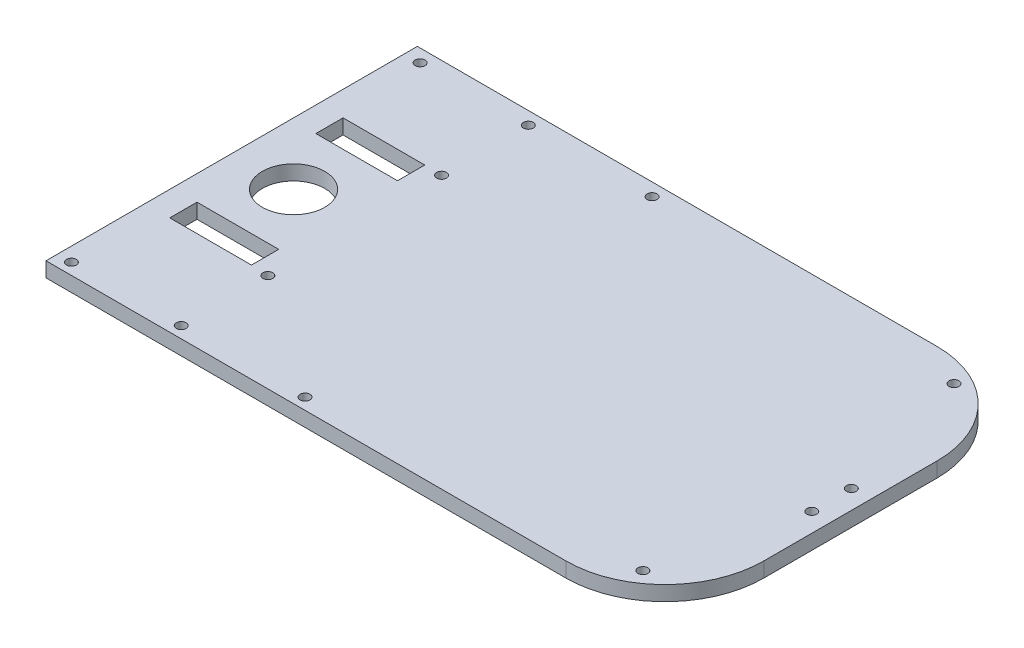
ISO-10303-21;
HEADER;
FILE_DESCRIPTION(('STEP AP214'),'2;1');
FILE_NAME('part.step','',(''),(''),'','','');
FILE_SCHEMA(('AUTOMOTIVE_DESIGN { 1 0 10303 214 1 1 1 1 }'));
ENDSEC;
DATA;
#1=APPLICATION_CONTEXT('core data for automotive mechanical design processes');
#2=APPLICATION_PROTOCOL_DEFINITION('international standard','automotive_design',2000,#1);
#3=PRODUCT_CONTEXT('',#1,'mechanical');
#4=PRODUCT('Part','Part','',(#3));
#5=PRODUCT_RELATED_PRODUCT_CATEGORY('part','',(#4));
#6=PRODUCT_DEFINITION_FORMATION('','',#4);
#7=PRODUCT_DEFINITION_CONTEXT('part definition',#1,'design');
#8=PRODUCT_DEFINITION('design','',#6,#7);
#9=PRODUCT_DEFINITION_SHAPE('','',#8);
#10=(LENGTH_UNIT() NAMED_UNIT(*) SI_UNIT(.MILLI.,.METRE.));
#11=(NAMED_UNIT(*) PLANE_ANGLE_UNIT() SI_UNIT($,.RADIAN.));
#12=(NAMED_UNIT(*) SI_UNIT($,.STERADIAN.) SOLID_ANGLE_UNIT());
#13=UNCERTAINTY_MEASURE_WITH_UNIT(LENGTH_MEASURE(1.E-05),#10,'distance_accuracy_value','');
#14=(GEOMETRIC_REPRESENTATION_CONTEXT(3) GLOBAL_UNCERTAINTY_ASSIGNED_CONTEXT((#13)) GLOBAL_UNIT_ASSIGNED_CONTEXT((#10,
#11,#12)) REPRESENTATION_CONTEXT('',''));
#15=CARTESIAN_POINT('',(0.,0.,0.));
#16=DIRECTION('',(0.,0.,1.));
#17=DIRECTION('',(1.,0.,0.));
#18=AXIS2_PLACEMENT_3D('',#15,#16,#17);
#19=CARTESIAN_POINT('',(0.,6.,0.));
#20=DIRECTION('',(1.,0.,0.));
#21=DIRECTION('',(0.,0.,-1.));
#22=AXIS2_PLACEMENT_3D('',#19,#20,#21);
#23=PLANE('',#22);
#24=DIRECTION('',(0.,0.,1.));
#25=VECTOR('',#24,1.);
#26=CARTESIAN_POINT('',(0.,0.,0.));
#27=LINE('',#26,#25);
#28=CARTESIAN_POINT('',(0.,0.,-150.));
#29=VERTEX_POINT('',#28);
#30=CARTESIAN_POINT('',(0.,0.,0.));
#31=VERTEX_POINT('',#30);
#32=EDGE_CURVE('E339',#29,#31,#27,.T.);
#33=ORIENTED_EDGE('',*,*,#32,.T.);
#34=DIRECTION('',(0.,-1.,0.));
#35=VECTOR('',#34,1.);
#36=CARTESIAN_POINT('',(0.,6.,0.));
#37=LINE('',#36,#35);
#38=CARTESIAN_POINT('',(0.,6.,0.));
#39=VERTEX_POINT('',#38);
#40=EDGE_CURVE('E11',#39,#31,#37,.T.);
#41=ORIENTED_EDGE('',*,*,#40,.F.);
#42=DIRECTION('',(0.,0.,1.));
#43=VECTOR('',#42,1.);
#44=CARTESIAN_POINT('',(0.,6.,0.));
#45=LINE('',#44,#43);
#46=CARTESIAN_POINT('',(0.,6.,-150.));
#47=VERTEX_POINT('',#46);
#48=EDGE_CURVE('E343',#47,#39,#45,.T.);
#49=ORIENTED_EDGE('',*,*,#48,.F.);
#50=DIRECTION('',(0.,-1.,0.));
#51=VECTOR('',#50,1.);
#52=CARTESIAN_POINT('',(0.,6.,-150.));
#53=LINE('',#52,#51);
#54=EDGE_CURVE('E363',#47,#29,#53,.T.);
#55=ORIENTED_EDGE('',*,*,#54,.T.);
#56=EDGE_LOOP('',(#33,#41,#49,#55));
#57=FACE_BOUND('',#56,.T.);
#58=ADVANCED_FACE('F44',(#57),#23,.F.);
#59=CARTESIAN_POINT('',(0.,6.,0.));
#60=DIRECTION('',(0.,0.,-1.));
#61=DIRECTION('',(-1.,0.,0.));
#62=AXIS2_PLACEMENT_3D('',#59,#60,#61);
#63=PLANE('',#62);
#64=DIRECTION('',(1.,0.,0.));
#65=VECTOR('',#64,1.);
#66=CARTESIAN_POINT('',(0.,0.,0.));
#67=LINE('',#66,#65);
#68=CARTESIAN_POINT('',(210.,0.,0.));
#69=VERTEX_POINT('',#68);
#70=EDGE_CURVE('E367',#31,#69,#67,.T.);
#71=ORIENTED_EDGE('',*,*,#70,.T.);
#72=DIRECTION('',(0.,-1.,0.));
#73=VECTOR('',#72,1.);
#74=CARTESIAN_POINT('',(210.,6.,0.));
#75=LINE('',#74,#73);
#76=CARTESIAN_POINT('',(210.,6.,0.));
#77=VERTEX_POINT('',#76);
#78=EDGE_CURVE('E52',#77,#69,#75,.T.);
#79=ORIENTED_EDGE('',*,*,#78,.F.);
#80=DIRECTION('',(1.,0.,0.));
#81=VECTOR('',#80,1.);
#82=CARTESIAN_POINT('',(0.,6.,0.));
#83=LINE('',#82,#81);
#84=EDGE_CURVE('E347',#39,#77,#83,.T.);
#85=ORIENTED_EDGE('',*,*,#84,.F.);
#86=ORIENTED_EDGE('',*,*,#40,.T.);
#87=EDGE_LOOP('',(#71,#79,#85,#86));
#88=FACE_BOUND('',#87,.T.);
#89=ADVANCED_FACE('F423',(#88),#63,.F.);
#90=CARTESIAN_POINT('',(210.,6.,-40.));
#91=DIRECTION('',(0.,-1.,0.));
#92=DIRECTION('',(0.,0.,-1.));
#93=AXIS2_PLACEMENT_3D('',#90,#91,#92);
#94=CYLINDRICAL_SURFACE('',#93,40.);
#95=CARTESIAN_POINT('',(210.,0.,-40.));
#96=DIRECTION('',(0.,1.,0.));
#97=DIRECTION('',(0.,0.,1.));
#98=AXIS2_PLACEMENT_3D('',#95,#96,#97);
#99=CIRCLE('',#98,40.);
#100=CARTESIAN_POINT('',(250.,0.,-40.0000000000003));
#101=VERTEX_POINT('',#100);
#102=EDGE_CURVE('E370',#69,#101,#99,.T.);
#103=ORIENTED_EDGE('',*,*,#102,.T.);
#104=DIRECTION('',(0.,-1.,0.));
#105=VECTOR('',#104,1.);
#106=CARTESIAN_POINT('',(250.,6.,-40.0000000000003));
#107=LINE('',#106,#105);
#108=CARTESIAN_POINT('',(250.,6.,-40.0000000000003));
#109=VERTEX_POINT('',#108);
#110=EDGE_CURVE('E392',#109,#101,#107,.T.);
#111=ORIENTED_EDGE('',*,*,#110,.F.);
#112=CARTESIAN_POINT('',(210.,6.,-40.));
#113=DIRECTION('',(0.,1.,0.));
#114=DIRECTION('',(0.,0.,1.));
#115=AXIS2_PLACEMENT_3D('',#112,#113,#114);
#116=CIRCLE('',#115,40.);
#117=EDGE_CURVE('E351',#77,#109,#116,.T.);
#118=ORIENTED_EDGE('',*,*,#117,.F.);
#119=ORIENTED_EDGE('',*,*,#78,.T.);
#120=EDGE_LOOP('',(#103,#111,#118,#119));
#121=FACE_BOUND('',#120,.T.);
#122=ADVANCED_FACE('F401',(#121),#94,.T.);
#123=CARTESIAN_POINT('',(250.,6.,-40.0000000000003));
#124=DIRECTION('',(-1.,0.,0.));
#125=DIRECTION('',(0.,0.,1.));
#126=AXIS2_PLACEMENT_3D('',#123,#124,#125);
#127=PLANE('',#126);
#128=DIRECTION('',(0.,0.,-1.));
#129=VECTOR('',#128,1.);
#130=CARTESIAN_POINT('',(250.,0.,-40.0000000000003));
#131=LINE('',#130,#129);
#132=CARTESIAN_POINT('',(250.,0.,-110.));
#133=VERTEX_POINT('',#132);
#134=EDGE_CURVE('E373',#101,#133,#131,.T.);
#135=ORIENTED_EDGE('',*,*,#134,.T.);
#136=DIRECTION('',(0.,-1.,0.));
#137=VECTOR('',#136,1.);
#138=CARTESIAN_POINT('',(250.,6.,-110.));
#139=LINE('',#138,#137);
#140=CARTESIAN_POINT('',(250.,6.,-110.));
#141=VERTEX_POINT('',#140);
#142=EDGE_CURVE('E388',#141,#133,#139,.T.);
#143=ORIENTED_EDGE('',*,*,#142,.F.);
#144=DIRECTION('',(0.,0.,-1.));
#145=VECTOR('',#144,1.);
#146=CARTESIAN_POINT('',(250.,6.,-40.0000000000003));
#147=LINE('',#146,#145);
#148=EDGE_CURVE('E354',#109,#141,#147,.T.);
#149=ORIENTED_EDGE('',*,*,#148,.F.);
#150=ORIENTED_EDGE('',*,*,#110,.T.);
#151=EDGE_LOOP('',(#135,#143,#149,#150));
#152=FACE_BOUND('',#151,.T.);
#153=ADVANCED_FACE('F411',(#152),#127,.F.);
#154=CARTESIAN_POINT('',(210.,6.,-110.));
#155=DIRECTION('',(0.,-1.,0.));
#156=DIRECTION('',(0.,0.,-1.));
#157=AXIS2_PLACEMENT_3D('',#154,#155,#156);
#158=CYLINDRICAL_SURFACE('',#157,40.);
#159=CARTESIAN_POINT('',(210.,0.,-110.));
#160=DIRECTION('',(0.,1.,0.));
#161=DIRECTION('',(0.,0.,1.));
#162=AXIS2_PLACEMENT_3D('',#159,#160,#161);
#163=CIRCLE('',#162,40.);
#164=CARTESIAN_POINT('',(210.,0.,-150.));
#165=VERTEX_POINT('',#164);
#166=EDGE_CURVE('E376',#133,#165,#163,.T.);
#167=ORIENTED_EDGE('',*,*,#166,.T.);
#168=DIRECTION('',(0.,-1.,0.));
#169=VECTOR('',#168,1.);
#170=CARTESIAN_POINT('',(210.,6.,-150.));
#171=LINE('',#170,#169);
#172=CARTESIAN_POINT('',(210.,6.,-150.));
#173=VERTEX_POINT('',#172);
#174=EDGE_CURVE('E384',#173,#165,#171,.T.);
#175=ORIENTED_EDGE('',*,*,#174,.F.);
#176=CARTESIAN_POINT('',(210.,6.,-110.));
#177=DIRECTION('',(0.,1.,0.));
#178=DIRECTION('',(0.,0.,1.));
#179=AXIS2_PLACEMENT_3D('',#176,#177,#178);
#180=CIRCLE('',#179,40.);
#181=EDGE_CURVE('E357',#141,#173,#180,.T.);
#182=ORIENTED_EDGE('',*,*,#181,.F.);
#183=ORIENTED_EDGE('',*,*,#142,.T.);
#184=EDGE_LOOP('',(#167,#175,#182,#183));
#185=FACE_BOUND('',#184,.T.);
#186=ADVANCED_FACE('F415',(#185),#158,.T.);
#187=CARTESIAN_POINT('',(0.,6.,-150.));
#188=DIRECTION('',(0.,0.,1.));
#189=DIRECTION('',(1.,0.,0.));
#190=AXIS2_PLACEMENT_3D('',#187,#188,#189);
#191=PLANE('',#190);
#192=DIRECTION('',(-1.,0.,0.));
#193=VECTOR('',#192,1.);
#194=CARTESIAN_POINT('',(0.,0.,-150.));
#195=LINE('',#194,#193);
#196=EDGE_CURVE('E348',#165,#29,#195,.T.);
#197=ORIENTED_EDGE('',*,*,#196,.T.);
#198=ORIENTED_EDGE('',*,*,#54,.F.);
#199=DIRECTION('',(-1.,0.,0.));
#200=VECTOR('',#199,1.);
#201=CARTESIAN_POINT('',(0.,6.,-150.));
#202=LINE('',#201,#200);
#203=EDGE_CURVE('E360',#173,#47,#202,.T.);
#204=ORIENTED_EDGE('',*,*,#203,.F.);
#205=ORIENTED_EDGE('',*,*,#174,.T.);
#206=EDGE_LOOP('',(#197,#198,#204,#205));
#207=FACE_BOUND('',#206,.T.);
#208=ADVANCED_FACE('F426',(#207),#191,.F.);
#209=CARTESIAN_POINT('',(210.,6.,-110.));
#210=DIRECTION('',(0.,1.,0.));
#211=DIRECTION('',(0.,0.,1.));
#212=AXIS2_PLACEMENT_3D('',#209,#210,#211);
#213=PLANE('',#212);
#214=DIRECTION('',(0.,0.,1.));
#215=VECTOR('',#214,1.);
#216=CARTESIAN_POINT('',(10.,6.,-110.));
#217=LINE('',#216,#215);
#218=CARTESIAN_POINT('',(10.,6.,-110.));
#219=VERTEX_POINT('',#218);
#220=CARTESIAN_POINT('',(10.,6.,-99.));
#221=VERTEX_POINT('',#220);
#222=EDGE_CURVE('E59',#219,#221,#217,.T.);
#223=ORIENTED_EDGE('',*,*,#222,.F.);
#224=DIRECTION('',(-1.,0.,0.));
#225=VECTOR('',#224,1.);
#226=CARTESIAN_POINT('',(10.,6.,-110.));
#227=LINE('',#226,#225);
#228=CARTESIAN_POINT('',(43.,6.,-110.));
#229=VERTEX_POINT('',#228);
#230=EDGE_CURVE('E169',#229,#219,#227,.T.);
#231=ORIENTED_EDGE('',*,*,#230,.F.);
#232=DIRECTION('',(0.,0.,-1.));
#233=VECTOR('',#232,1.);
#234=CARTESIAN_POINT('',(43.,6.,-110.));
#235=LINE('',#234,#233);
#236=CARTESIAN_POINT('',(43.,6.,-99.));
#237=VERTEX_POINT('',#236);
#238=EDGE_CURVE('E173',#237,#229,#235,.T.);
#239=ORIENTED_EDGE('',*,*,#238,.F.);
#240=DIRECTION('',(1.,0.,0.));
#241=VECTOR('',#240,1.);
#242=CARTESIAN_POINT('',(10.,6.,-99.));
#243=LINE('',#242,#241);
#244=EDGE_CURVE('E182',#221,#237,#243,.T.);
#245=ORIENTED_EDGE('',*,*,#244,.F.);
#246=EDGE_LOOP('',(#223,#231,#239,#245));
#247=FACE_BOUND('',#246,.T.);
#248=DIRECTION('',(0.,0.,1.));
#249=VECTOR('',#248,1.);
#250=CARTESIAN_POINT('',(10.,6.,-51.));
#251=LINE('',#250,#249);
#252=CARTESIAN_POINT('',(10.,6.,-51.));
#253=VERTEX_POINT('',#252);
#254=CARTESIAN_POINT('',(10.,6.,-40.));
#255=VERTEX_POINT('',#254);
#256=EDGE_CURVE('E67',#253,#255,#251,.T.);
#257=ORIENTED_EDGE('',*,*,#256,.F.);
#258=DIRECTION('',(-1.,0.,0.));
#259=VECTOR('',#258,1.);
#260=CARTESIAN_POINT('',(10.,6.,-51.));
#261=LINE('',#260,#259);
#262=CARTESIAN_POINT('',(43.,6.,-51.));
#263=VERTEX_POINT('',#262);
#264=EDGE_CURVE('E210',#263,#253,#261,.T.);
#265=ORIENTED_EDGE('',*,*,#264,.F.);
#266=DIRECTION('',(0.,0.,-1.));
#267=VECTOR('',#266,1.);
#268=CARTESIAN_POINT('',(43.,6.,-51.));
#269=LINE('',#268,#267);
#270=CARTESIAN_POINT('',(43.,6.,-40.));
#271=VERTEX_POINT('',#270);
#272=EDGE_CURVE('E214',#271,#263,#269,.T.);
#273=ORIENTED_EDGE('',*,*,#272,.F.);
#274=DIRECTION('',(1.,0.,0.));
#275=VECTOR('',#274,1.);
#276=CARTESIAN_POINT('',(10.,6.,-40.));
#277=LINE('',#276,#275);
#278=EDGE_CURVE('E219',#255,#271,#277,.T.);
#279=ORIENTED_EDGE('',*,*,#278,.F.);
#280=EDGE_LOOP('',(#257,#265,#273,#279));
#281=FACE_BOUND('',#280,.T.);
#282=CARTESIAN_POINT('',(50.,6.,-4.63));
#283=DIRECTION('',(0.,1.,0.));
#284=DIRECTION('',(0.,0.,1.));
#285=AXIS2_PLACEMENT_3D('',#282,#283,#284);
#286=CIRCLE('',#285,2.);
#287=CARTESIAN_POINT('',(50.,6.,-2.63));
#288=VERTEX_POINT('',#287);
#289=EDGE_CURVE('E247',#288,#288,#286,.T.);
#290=ORIENTED_EDGE('',*,*,#289,.F.);
#291=EDGE_LOOP('',(#290));
#292=FACE_BOUND('',#291,.T.);
#293=CARTESIAN_POINT('',(100.,6.,-4.63));
#294=DIRECTION('',(0.,1.,0.));
#295=DIRECTION('',(0.,0.,1.));
#296=AXIS2_PLACEMENT_3D('',#293,#294,#295);
#297=CIRCLE('',#296,2.);
#298=CARTESIAN_POINT('',(100.,6.,-2.63));
#299=VERTEX_POINT('',#298);
#300=EDGE_CURVE('E256',#299,#299,#297,.T.);
#301=ORIENTED_EDGE('',*,*,#300,.F.);
#302=EDGE_LOOP('',(#301));
#303=FACE_BOUND('',#302,.T.);
#304=CARTESIAN_POINT('',(100.,6.,-144.82));
#305=DIRECTION('',(0.,1.,0.));
#306=DIRECTION('',(0.,0.,1.));
#307=AXIS2_PLACEMENT_3D('',#304,#305,#306);
#308=CIRCLE('',#307,2.);
#309=CARTESIAN_POINT('',(100.,6.,-142.82));
#310=VERTEX_POINT('',#309);
#311=EDGE_CURVE('E264',#310,#310,#308,.T.);
#312=ORIENTED_EDGE('',*,*,#311,.F.);
#313=EDGE_LOOP('',(#312));
#314=FACE_BOUND('',#313,.T.);
#315=CARTESIAN_POINT('',(50.,6.,-109.82));
#316=DIRECTION('',(0.,1.,0.));
#317=DIRECTION('',(0.,0.,1.));
#318=AXIS2_PLACEMENT_3D('',#315,#316,#317);
#319=CIRCLE('',#318,2.);
#320=CARTESIAN_POINT('',(50.,6.,-107.82));
#321=VERTEX_POINT('',#320);
#322=EDGE_CURVE('E272',#321,#321,#319,.T.);
#323=ORIENTED_EDGE('',*,*,#322,.F.);
#324=EDGE_LOOP('',(#323));
#325=FACE_BOUND('',#324,.T.);
#326=CARTESIAN_POINT('',(50.,6.,-39.63));
#327=DIRECTION('',(0.,1.,0.));
#328=DIRECTION('',(0.,0.,1.));
#329=AXIS2_PLACEMENT_3D('',#326,#327,#328);
#330=CIRCLE('',#329,2.);
#331=CARTESIAN_POINT('',(50.,6.,-37.63));
#332=VERTEX_POINT('',#331);
#333=EDGE_CURVE('E239',#332,#332,#330,.T.);
#334=ORIENTED_EDGE('',*,*,#333,.F.);
#335=EDGE_LOOP('',(#334));
#336=FACE_BOUND('',#335,.T.);
#337=CARTESIAN_POINT('',(50.,6.,-144.82));
#338=DIRECTION('',(0.,1.,0.));
#339=DIRECTION('',(0.,0.,1.));
#340=AXIS2_PLACEMENT_3D('',#337,#338,#339);
#341=CIRCLE('',#340,2.);
#342=CARTESIAN_POINT('',(50.,6.,-142.82));
#343=VERTEX_POINT('',#342);
#344=EDGE_CURVE('E251',#343,#343,#341,.T.);
#345=ORIENTED_EDGE('',*,*,#344,.F.);
#346=EDGE_LOOP('',(#345));
#347=FACE_BOUND('',#346,.T.);
#348=CARTESIAN_POINT('',(242.339859995876,6.,-83.));
#349=DIRECTION('',(0.,1.,0.));
#350=DIRECTION('',(0.,0.,1.));
#351=AXIS2_PLACEMENT_3D('',#348,#349,#350);
#352=CIRCLE('',#351,2.);
#353=CARTESIAN_POINT('',(242.339859995876,6.,-81.));
#354=VERTEX_POINT('',#353);
#355=EDGE_CURVE('E292',#354,#354,#352,.T.);
#356=ORIENTED_EDGE('',*,*,#355,.F.);
#357=EDGE_LOOP('',(#356));
#358=FACE_BOUND('',#357,.T.);
#359=CARTESIAN_POINT('',(242.339859995876,6.,-67.));
#360=DIRECTION('',(0.,1.,0.));
#361=DIRECTION('',(0.,0.,1.));
#362=AXIS2_PLACEMENT_3D('',#359,#360,#361);
#363=CIRCLE('',#362,2.);
#364=CARTESIAN_POINT('',(242.339859995876,6.,-65.));
#365=VERTEX_POINT('',#364);
#366=EDGE_CURVE('E296',#365,#365,#363,.T.);
#367=ORIENTED_EDGE('',*,*,#366,.F.);
#368=EDGE_LOOP('',(#367));
#369=FACE_BOUND('',#368,.T.);
#370=CARTESIAN_POINT('',(228.949949787565,6.,-12.1645825910987));
#371=DIRECTION('',(0.,1.,0.));
#372=DIRECTION('',(0.,0.,1.));
#373=AXIS2_PLACEMENT_3D('',#370,#371,#372);
#374=CIRCLE('',#373,2.);
#375=CARTESIAN_POINT('',(228.949949787565,6.,-10.1645825910987));
#376=VERTEX_POINT('',#375);
#377=EDGE_CURVE('E291',#376,#376,#374,.T.);
#378=ORIENTED_EDGE('',*,*,#377,.F.);
#379=EDGE_LOOP('',(#378));
#380=FACE_BOUND('',#379,.T.);
#381=CARTESIAN_POINT('',(226.364130141109,6.,-140.421237055358));
#382=DIRECTION('',(0.,1.,0.));
#383=DIRECTION('',(0.,0.,1.));
#384=AXIS2_PLACEMENT_3D('',#381,#382,#383);
#385=CIRCLE('',#384,2.);
#386=CARTESIAN_POINT('',(226.364130141109,6.,-138.421237055358));
#387=VERTEX_POINT('',#386);
#388=EDGE_CURVE('E307',#387,#387,#385,.T.);
#389=ORIENTED_EDGE('',*,*,#388,.F.);
#390=EDGE_LOOP('',(#389));
#391=FACE_BOUND('',#390,.T.);
#392=CARTESIAN_POINT('',(5.63572035741244,6.,-4.63282920356067));
#393=DIRECTION('',(0.,1.,0.));
#394=DIRECTION('',(0.,0.,1.));
#395=AXIS2_PLACEMENT_3D('',#392,#393,#394);
#396=CIRCLE('',#395,2.);
#397=CARTESIAN_POINT('',(5.63572035741244,6.,-2.63282920356067));
#398=VERTEX_POINT('',#397);
#399=EDGE_CURVE('E315',#398,#398,#396,.T.);
#400=ORIENTED_EDGE('',*,*,#399,.F.);
#401=EDGE_LOOP('',(#400));
#402=FACE_BOUND('',#401,.T.);
#403=CARTESIAN_POINT('',(6.31087822763052,6.,-144.817130454335));
#404=DIRECTION('',(0.,1.,0.));
#405=DIRECTION('',(0.,0.,1.));
#406=AXIS2_PLACEMENT_3D('',#403,#404,#405);
#407=CIRCLE('',#406,2.);
#408=CARTESIAN_POINT('',(6.31087822763052,6.,-142.817130454335));
#409=VERTEX_POINT('',#408);
#410=EDGE_CURVE('E323',#409,#409,#407,.T.);
#411=ORIENTED_EDGE('',*,*,#410,.F.);
#412=EDGE_LOOP('',(#411));
#413=FACE_BOUND('',#412,.T.);
#414=CARTESIAN_POINT('',(25.,6.,-75.));
#415=DIRECTION('',(0.,-1.,0.));
#416=DIRECTION('',(0.,0.,-1.));
#417=AXIS2_PLACEMENT_3D('',#414,#415,#416);
#418=CIRCLE('',#417,12.59794853);
#419=CARTESIAN_POINT('',(25.,6.,-87.59794853));
#420=VERTEX_POINT('',#419);
#421=EDGE_CURVE('E335',#420,#420,#418,.T.);
#422=ORIENTED_EDGE('',*,*,#421,.T.);
#423=EDGE_LOOP('',(#422));
#424=FACE_BOUND('',#423,.T.);
#425=ORIENTED_EDGE('',*,*,#48,.T.);
#426=ORIENTED_EDGE('',*,*,#84,.T.);
#427=ORIENTED_EDGE('',*,*,#117,.T.);
#428=ORIENTED_EDGE('',*,*,#148,.T.);
#429=ORIENTED_EDGE('',*,*,#181,.T.);
#430=ORIENTED_EDGE('',*,*,#203,.T.);
#431=EDGE_LOOP('',(#425,#426,#427,#428,#429,#430));
#432=FACE_BOUND('',#431,.T.);
#433=ADVANCED_FACE('F419',(#247,#281,#292,#303,#314,#325,#336,#347,#358,#369,#380,#391,#402,
#413,#424,#432),#213,.T.);
#434=CARTESIAN_POINT('',(210.,0.,-110.));
#435=DIRECTION('',(0.,1.,0.));
#436=DIRECTION('',(0.,0.,1.));
#437=AXIS2_PLACEMENT_3D('',#434,#435,#436);
#438=PLANE('',#437);
#439=DIRECTION('',(-1.,0.,0.));
#440=VECTOR('',#439,1.);
#441=CARTESIAN_POINT('',(10.,0.,-110.));
#442=LINE('',#441,#440);
#443=CARTESIAN_POINT('',(43.,0.,-110.));
#444=VERTEX_POINT('',#443);
#445=CARTESIAN_POINT('',(10.,0.,-110.));
#446=VERTEX_POINT('',#445);
#447=EDGE_CURVE('E154',#444,#446,#442,.T.);
#448=ORIENTED_EDGE('',*,*,#447,.T.);
#449=DIRECTION('',(0.,0.,1.));
#450=VECTOR('',#449,1.);
#451=CARTESIAN_POINT('',(10.,0.,-110.));
#452=LINE('',#451,#450);
#453=CARTESIAN_POINT('',(10.,0.,-99.));
#454=VERTEX_POINT('',#453);
#455=EDGE_CURVE('E147',#446,#454,#452,.T.);
#456=ORIENTED_EDGE('',*,*,#455,.T.);
#457=DIRECTION('',(1.,0.,0.));
#458=VECTOR('',#457,1.);
#459=CARTESIAN_POINT('',(10.,0.,-99.));
#460=LINE('',#459,#458);
#461=CARTESIAN_POINT('',(43.,0.,-99.));
#462=VERTEX_POINT('',#461);
#463=EDGE_CURVE('E158',#454,#462,#460,.T.);
#464=ORIENTED_EDGE('',*,*,#463,.T.);
#465=DIRECTION('',(0.,0.,-1.));
#466=VECTOR('',#465,1.);
#467=CARTESIAN_POINT('',(43.,0.,-110.));
#468=LINE('',#467,#466);
#469=EDGE_CURVE('E163',#462,#444,#468,.T.);
#470=ORIENTED_EDGE('',*,*,#469,.T.);
#471=EDGE_LOOP('',(#448,#456,#464,#470));
#472=FACE_BOUND('',#471,.T.);
#473=DIRECTION('',(-1.,0.,0.));
#474=VECTOR('',#473,1.);
#475=CARTESIAN_POINT('',(10.,0.,-51.));
#476=LINE('',#475,#474);
#477=CARTESIAN_POINT('',(43.,0.,-51.));
#478=VERTEX_POINT('',#477);
#479=CARTESIAN_POINT('',(10.,0.,-51.));
#480=VERTEX_POINT('',#479);
#481=EDGE_CURVE('E200',#478,#480,#476,.T.);
#482=ORIENTED_EDGE('',*,*,#481,.T.);
#483=DIRECTION('',(0.,0.,1.));
#484=VECTOR('',#483,1.);
#485=CARTESIAN_POINT('',(10.,0.,-51.));
#486=LINE('',#485,#484);
#487=CARTESIAN_POINT('',(10.,0.,-40.));
#488=VERTEX_POINT('',#487);
#489=EDGE_CURVE('E215',#480,#488,#486,.T.);
#490=ORIENTED_EDGE('',*,*,#489,.T.);
#491=DIRECTION('',(1.,0.,0.));
#492=VECTOR('',#491,1.);
#493=CARTESIAN_POINT('',(10.,0.,-40.));
#494=LINE('',#493,#492);
#495=CARTESIAN_POINT('',(43.,0.,-40.));
#496=VERTEX_POINT('',#495);
#497=EDGE_CURVE('E232',#488,#496,#494,.T.);
#498=ORIENTED_EDGE('',*,*,#497,.T.);
#499=DIRECTION('',(0.,0.,-1.));
#500=VECTOR('',#499,1.);
#501=CARTESIAN_POINT('',(43.,0.,-51.));
#502=LINE('',#501,#500);
#503=EDGE_CURVE('E228',#496,#478,#502,.T.);
#504=ORIENTED_EDGE('',*,*,#503,.T.);
#505=EDGE_LOOP('',(#482,#490,#498,#504));
#506=FACE_BOUND('',#505,.T.);
#507=CARTESIAN_POINT('',(50.,0.,-4.63));
#508=DIRECTION('',(0.,1.,0.));
#509=DIRECTION('',(0.,0.,1.));
#510=AXIS2_PLACEMENT_3D('',#507,#508,#509);
#511=CIRCLE('',#510,2.);
#512=CARTESIAN_POINT('',(50.,0.,-2.63));
#513=VERTEX_POINT('',#512);
#514=EDGE_CURVE('E252',#513,#513,#511,.T.);
#515=ORIENTED_EDGE('',*,*,#514,.T.);
#516=EDGE_LOOP('',(#515));
#517=FACE_BOUND('',#516,.T.);
#518=CARTESIAN_POINT('',(100.,0.,-4.63));
#519=DIRECTION('',(0.,1.,0.));
#520=DIRECTION('',(0.,0.,1.));
#521=AXIS2_PLACEMENT_3D('',#518,#519,#520);
#522=CIRCLE('',#521,2.);
#523=CARTESIAN_POINT('',(100.,0.,-2.63));
#524=VERTEX_POINT('',#523);
#525=EDGE_CURVE('E260',#524,#524,#522,.T.);
#526=ORIENTED_EDGE('',*,*,#525,.T.);
#527=EDGE_LOOP('',(#526));
#528=FACE_BOUND('',#527,.T.);
#529=CARTESIAN_POINT('',(100.,0.,-144.82));
#530=DIRECTION('',(0.,1.,0.));
#531=DIRECTION('',(0.,0.,1.));
#532=AXIS2_PLACEMENT_3D('',#529,#530,#531);
#533=CIRCLE('',#532,2.);
#534=CARTESIAN_POINT('',(100.,0.,-142.82));
#535=VERTEX_POINT('',#534);
#536=EDGE_CURVE('E268',#535,#535,#533,.T.);
#537=ORIENTED_EDGE('',*,*,#536,.T.);
#538=EDGE_LOOP('',(#537));
#539=FACE_BOUND('',#538,.T.);
#540=CARTESIAN_POINT('',(50.,0.,-109.82));
#541=DIRECTION('',(0.,1.,0.));
#542=DIRECTION('',(0.,0.,1.));
#543=AXIS2_PLACEMENT_3D('',#540,#541,#542);
#544=CIRCLE('',#543,2.);
#545=CARTESIAN_POINT('',(50.,0.,-107.82));
#546=VERTEX_POINT('',#545);
#547=EDGE_CURVE('E243',#546,#546,#544,.T.);
#548=ORIENTED_EDGE('',*,*,#547,.T.);
#549=EDGE_LOOP('',(#548));
#550=FACE_BOUND('',#549,.T.);
#551=CARTESIAN_POINT('',(50.,0.,-39.63));
#552=DIRECTION('',(0.,1.,0.));
#553=DIRECTION('',(0.,0.,1.));
#554=AXIS2_PLACEMENT_3D('',#551,#552,#553);
#555=CIRCLE('',#554,2.);
#556=CARTESIAN_POINT('',(50.,0.,-37.63));
#557=VERTEX_POINT('',#556);
#558=EDGE_CURVE('E191',#557,#557,#555,.T.);
#559=ORIENTED_EDGE('',*,*,#558,.T.);
#560=EDGE_LOOP('',(#559));
#561=FACE_BOUND('',#560,.T.);
#562=CARTESIAN_POINT('',(50.,0.,-144.82));
#563=DIRECTION('',(0.,1.,0.));
#564=DIRECTION('',(0.,0.,1.));
#565=AXIS2_PLACEMENT_3D('',#562,#563,#564);
#566=CIRCLE('',#565,2.);
#567=CARTESIAN_POINT('',(50.,0.,-142.82));
#568=VERTEX_POINT('',#567);
#569=EDGE_CURVE('E279',#568,#568,#566,.T.);
#570=ORIENTED_EDGE('',*,*,#569,.T.);
#571=EDGE_LOOP('',(#570));
#572=FACE_BOUND('',#571,.T.);
#573=CARTESIAN_POINT('',(242.339859995876,0.,-83.));
#574=DIRECTION('',(0.,1.,0.));
#575=DIRECTION('',(0.,0.,1.));
#576=AXIS2_PLACEMENT_3D('',#573,#574,#575);
#577=CIRCLE('',#576,2.);
#578=CARTESIAN_POINT('',(242.339859995876,0.,-81.));
#579=VERTEX_POINT('',#578);
#580=EDGE_CURVE('E287',#579,#579,#577,.T.);
#581=ORIENTED_EDGE('',*,*,#580,.T.);
#582=EDGE_LOOP('',(#581));
#583=FACE_BOUND('',#582,.T.);
#584=CARTESIAN_POINT('',(242.339859995876,0.,-67.));
#585=DIRECTION('',(0.,1.,0.));
#586=DIRECTION('',(0.,0.,1.));
#587=AXIS2_PLACEMENT_3D('',#584,#585,#586);
#588=CIRCLE('',#587,2.);
#589=CARTESIAN_POINT('',(242.339859995876,0.,-65.));
#590=VERTEX_POINT('',#589);
#591=EDGE_CURVE('E283',#590,#590,#588,.T.);
#592=ORIENTED_EDGE('',*,*,#591,.T.);
#593=EDGE_LOOP('',(#592));
#594=FACE_BOUND('',#593,.T.);
#595=CARTESIAN_POINT('',(228.949949787565,0.,-12.1645825910987));
#596=DIRECTION('',(0.,1.,0.));
#597=DIRECTION('',(0.,0.,1.));
#598=AXIS2_PLACEMENT_3D('',#595,#596,#597);
#599=CIRCLE('',#598,2.);
#600=CARTESIAN_POINT('',(228.949949787565,0.,-10.1645825910987));
#601=VERTEX_POINT('',#600);
#602=EDGE_CURVE('E303',#601,#601,#599,.T.);
#603=ORIENTED_EDGE('',*,*,#602,.T.);
#604=EDGE_LOOP('',(#603));
#605=FACE_BOUND('',#604,.T.);
#606=CARTESIAN_POINT('',(226.364130141109,0.,-140.421237055358));
#607=DIRECTION('',(0.,1.,0.));
#608=DIRECTION('',(0.,0.,1.));
#609=AXIS2_PLACEMENT_3D('',#606,#607,#608);
#610=CIRCLE('',#609,2.);
#611=CARTESIAN_POINT('',(226.364130141109,0.,-138.421237055358));
#612=VERTEX_POINT('',#611);
#613=EDGE_CURVE('E311',#612,#612,#610,.T.);
#614=ORIENTED_EDGE('',*,*,#613,.T.);
#615=EDGE_LOOP('',(#614));
#616=FACE_BOUND('',#615,.T.);
#617=CARTESIAN_POINT('',(5.63572035741244,0.,-4.63282920356067));
#618=DIRECTION('',(0.,1.,0.));
#619=DIRECTION('',(0.,0.,1.));
#620=AXIS2_PLACEMENT_3D('',#617,#618,#619);
#621=CIRCLE('',#620,2.);
#622=CARTESIAN_POINT('',(5.63572035741244,0.,-2.63282920356067));
#623=VERTEX_POINT('',#622);
#624=EDGE_CURVE('E319',#623,#623,#621,.T.);
#625=ORIENTED_EDGE('',*,*,#624,.T.);
#626=EDGE_LOOP('',(#625));
#627=FACE_BOUND('',#626,.T.);
#628=CARTESIAN_POINT('',(6.31087822763052,0.,-144.817130454335));
#629=DIRECTION('',(0.,1.,0.));
#630=DIRECTION('',(0.,0.,1.));
#631=AXIS2_PLACEMENT_3D('',#628,#629,#630);
#632=CIRCLE('',#631,2.);
#633=CARTESIAN_POINT('',(6.31087822763052,0.,-142.817130454335));
#634=VERTEX_POINT('',#633);
#635=EDGE_CURVE('E327',#634,#634,#632,.T.);
#636=ORIENTED_EDGE('',*,*,#635,.T.);
#637=EDGE_LOOP('',(#636));
#638=FACE_BOUND('',#637,.T.);
#639=CARTESIAN_POINT('',(25.,0.,-75.));
#640=DIRECTION('',(0.,-1.,0.));
#641=DIRECTION('',(0.,0.,-1.));
#642=AXIS2_PLACEMENT_3D('',#639,#640,#641);
#643=CIRCLE('',#642,12.59794853);
#644=CARTESIAN_POINT('',(25.,0.,-87.59794853));
#645=VERTEX_POINT('',#644);
#646=EDGE_CURVE('E331',#645,#645,#643,.T.);
#647=ORIENTED_EDGE('',*,*,#646,.F.);
#648=EDGE_LOOP('',(#647));
#649=FACE_BOUND('',#648,.T.);
#650=ORIENTED_EDGE('',*,*,#32,.F.);
#651=ORIENTED_EDGE('',*,*,#196,.F.);
#652=ORIENTED_EDGE('',*,*,#166,.F.);
#653=ORIENTED_EDGE('',*,*,#134,.F.);
#654=ORIENTED_EDGE('',*,*,#102,.F.);
#655=ORIENTED_EDGE('',*,*,#70,.F.);
#656=EDGE_LOOP('',(#650,#651,#652,#653,#654,#655));
#657=FACE_BOUND('',#656,.T.);
#658=ADVANCED_FACE('F165',(#472,#506,#517,#528,#539,#550,#561,#572,#583,#594,#605,#616,#627,
#638,#649,#657),#438,.F.);
#659=CARTESIAN_POINT('',(25.,6.,-75.));
#660=DIRECTION('',(0.,-1.,0.));
#661=DIRECTION('',(0.,0.,-1.));
#662=AXIS2_PLACEMENT_3D('',#659,#660,#661);
#663=CYLINDRICAL_SURFACE('',#662,12.59794853);
#664=ORIENTED_EDGE('',*,*,#421,.F.);
#665=EDGE_LOOP('',(#664));
#666=FACE_BOUND('',#665,.T.);
#667=ORIENTED_EDGE('',*,*,#646,.T.);
#668=EDGE_LOOP('',(#667));
#669=FACE_BOUND('',#668,.T.);
#670=ADVANCED_FACE('F467',(#666,#669),#663,.F.);
#671=CARTESIAN_POINT('',(6.31087822763052,0.,-144.817130454335));
#672=DIRECTION('',(0.,1.,0.));
#673=DIRECTION('',(0.,0.,1.));
#674=AXIS2_PLACEMENT_3D('',#671,#672,#673);
#675=CYLINDRICAL_SURFACE('',#674,2.);
#676=ORIENTED_EDGE('',*,*,#635,.F.);
#677=EDGE_LOOP('',(#676));
#678=FACE_BOUND('',#677,.T.);
#679=ORIENTED_EDGE('',*,*,#410,.T.);
#680=EDGE_LOOP('',(#679));
#681=FACE_BOUND('',#680,.T.);
#682=ADVANCED_FACE('F472',(#678,#681),#675,.F.);
#683=CARTESIAN_POINT('',(5.63572035741244,0.,-4.63282920356067));
#684=DIRECTION('',(0.,1.,0.));
#685=DIRECTION('',(0.,0.,1.));
#686=AXIS2_PLACEMENT_3D('',#683,#684,#685);
#687=CYLINDRICAL_SURFACE('',#686,2.);
#688=ORIENTED_EDGE('',*,*,#624,.F.);
#689=EDGE_LOOP('',(#688));
#690=FACE_BOUND('',#689,.T.);
#691=ORIENTED_EDGE('',*,*,#399,.T.);
#692=EDGE_LOOP('',(#691));
#693=FACE_BOUND('',#692,.T.);
#694=ADVANCED_FACE('F485',(#690,#693),#687,.F.);
#695=CARTESIAN_POINT('',(226.364130141109,0.,-140.421237055358));
#696=DIRECTION('',(0.,1.,0.));
#697=DIRECTION('',(0.,0.,1.));
#698=AXIS2_PLACEMENT_3D('',#695,#696,#697);
#699=CYLINDRICAL_SURFACE('',#698,2.);
#700=ORIENTED_EDGE('',*,*,#613,.F.);
#701=EDGE_LOOP('',(#700));
#702=FACE_BOUND('',#701,.T.);
#703=ORIENTED_EDGE('',*,*,#388,.T.);
#704=EDGE_LOOP('',(#703));
#705=FACE_BOUND('',#704,.T.);
#706=ADVANCED_FACE('F496',(#702,#705),#699,.F.);
#707=CARTESIAN_POINT('',(228.949949787565,0.,-12.1645825910987));
#708=DIRECTION('',(0.,1.,0.));
#709=DIRECTION('',(0.,0.,1.));
#710=AXIS2_PLACEMENT_3D('',#707,#708,#709);
#711=CYLINDRICAL_SURFACE('',#710,2.);
#712=ORIENTED_EDGE('',*,*,#602,.F.);
#713=EDGE_LOOP('',(#712));
#714=FACE_BOUND('',#713,.T.);
#715=ORIENTED_EDGE('',*,*,#377,.T.);
#716=EDGE_LOOP('',(#715));
#717=FACE_BOUND('',#716,.T.);
#718=ADVANCED_FACE('F507',(#714,#717),#711,.F.);
#719=CARTESIAN_POINT('',(242.339859995876,0.,-67.));
#720=DIRECTION('',(0.,1.,0.));
#721=DIRECTION('',(0.,0.,1.));
#722=AXIS2_PLACEMENT_3D('',#719,#720,#721);
#723=CYLINDRICAL_SURFACE('',#722,2.);
#724=ORIENTED_EDGE('',*,*,#591,.F.);
#725=EDGE_LOOP('',(#724));
#726=FACE_BOUND('',#725,.T.);
#727=ORIENTED_EDGE('',*,*,#366,.T.);
#728=EDGE_LOOP('',(#727));
#729=FACE_BOUND('',#728,.T.);
#730=ADVANCED_FACE('F518',(#726,#729),#723,.F.);
#731=CARTESIAN_POINT('',(242.339859995876,0.,-83.));
#732=DIRECTION('',(0.,1.,0.));
#733=DIRECTION('',(0.,0.,1.));
#734=AXIS2_PLACEMENT_3D('',#731,#732,#733);
#735=CYLINDRICAL_SURFACE('',#734,2.);
#736=ORIENTED_EDGE('',*,*,#580,.F.);
#737=EDGE_LOOP('',(#736));
#738=FACE_BOUND('',#737,.T.);
#739=ORIENTED_EDGE('',*,*,#355,.T.);
#740=EDGE_LOOP('',(#739));
#741=FACE_BOUND('',#740,.T.);
#742=ADVANCED_FACE('F529',(#738,#741),#735,.F.);
#743=CARTESIAN_POINT('',(50.,0.,-144.82));
#744=DIRECTION('',(0.,1.,0.));
#745=DIRECTION('',(0.,0.,1.));
#746=AXIS2_PLACEMENT_3D('',#743,#744,#745);
#747=CYLINDRICAL_SURFACE('',#746,2.);
#748=ORIENTED_EDGE('',*,*,#569,.F.);
#749=EDGE_LOOP('',(#748));
#750=FACE_BOUND('',#749,.T.);
#751=ORIENTED_EDGE('',*,*,#344,.T.);
#752=EDGE_LOOP('',(#751));
#753=FACE_BOUND('',#752,.T.);
#754=ADVANCED_FACE('F540',(#750,#753),#747,.F.);
#755=CARTESIAN_POINT('',(50.,0.,-39.63));
#756=DIRECTION('',(0.,1.,0.));
#757=DIRECTION('',(0.,0.,1.));
#758=AXIS2_PLACEMENT_3D('',#755,#756,#757);
#759=CYLINDRICAL_SURFACE('',#758,2.);
#760=ORIENTED_EDGE('',*,*,#558,.F.);
#761=EDGE_LOOP('',(#760));
#762=FACE_BOUND('',#761,.T.);
#763=ORIENTED_EDGE('',*,*,#333,.T.);
#764=EDGE_LOOP('',(#763));
#765=FACE_BOUND('',#764,.T.);
#766=ADVANCED_FACE('F551',(#762,#765),#759,.F.);
#767=CARTESIAN_POINT('',(50.,0.,-109.82));
#768=DIRECTION('',(0.,1.,0.));
#769=DIRECTION('',(0.,0.,1.));
#770=AXIS2_PLACEMENT_3D('',#767,#768,#769);
#771=CYLINDRICAL_SURFACE('',#770,2.);
#772=ORIENTED_EDGE('',*,*,#547,.F.);
#773=EDGE_LOOP('',(#772));
#774=FACE_BOUND('',#773,.T.);
#775=ORIENTED_EDGE('',*,*,#322,.T.);
#776=EDGE_LOOP('',(#775));
#777=FACE_BOUND('',#776,.T.);
#778=ADVANCED_FACE('F562',(#774,#777),#771,.F.);
#779=CARTESIAN_POINT('',(100.,0.,-144.82));
#780=DIRECTION('',(0.,1.,0.));
#781=DIRECTION('',(0.,0.,1.));
#782=AXIS2_PLACEMENT_3D('',#779,#780,#781);
#783=CYLINDRICAL_SURFACE('',#782,2.);
#784=ORIENTED_EDGE('',*,*,#536,.F.);
#785=EDGE_LOOP('',(#784));
#786=FACE_BOUND('',#785,.T.);
#787=ORIENTED_EDGE('',*,*,#311,.T.);
#788=EDGE_LOOP('',(#787));
#789=FACE_BOUND('',#788,.T.);
#790=ADVANCED_FACE('F573',(#786,#789),#783,.F.);
#791=CARTESIAN_POINT('',(100.,0.,-4.63));
#792=DIRECTION('',(0.,1.,0.));
#793=DIRECTION('',(0.,0.,1.));
#794=AXIS2_PLACEMENT_3D('',#791,#792,#793);
#795=CYLINDRICAL_SURFACE('',#794,2.);
#796=ORIENTED_EDGE('',*,*,#525,.F.);
#797=EDGE_LOOP('',(#796));
#798=FACE_BOUND('',#797,.T.);
#799=ORIENTED_EDGE('',*,*,#300,.T.);
#800=EDGE_LOOP('',(#799));
#801=FACE_BOUND('',#800,.T.);
#802=ADVANCED_FACE('F584',(#798,#801),#795,.F.);
#803=CARTESIAN_POINT('',(50.,0.,-4.63));
#804=DIRECTION('',(0.,1.,0.));
#805=DIRECTION('',(0.,0.,1.));
#806=AXIS2_PLACEMENT_3D('',#803,#804,#805);
#807=CYLINDRICAL_SURFACE('',#806,2.);
#808=ORIENTED_EDGE('',*,*,#514,.F.);
#809=EDGE_LOOP('',(#808));
#810=FACE_BOUND('',#809,.T.);
#811=ORIENTED_EDGE('',*,*,#289,.T.);
#812=EDGE_LOOP('',(#811));
#813=FACE_BOUND('',#812,.T.);
#814=ADVANCED_FACE('F595',(#810,#813),#807,.F.);
#815=CARTESIAN_POINT('',(10.,0.,-51.));
#816=DIRECTION('',(-1.,0.,0.));
#817=DIRECTION('',(0.,0.,1.));
#818=AXIS2_PLACEMENT_3D('',#815,#816,#817);
#819=PLANE('',#818);
#820=ORIENTED_EDGE('',*,*,#256,.T.);
#821=DIRECTION('',(0.,1.,0.));
#822=VECTOR('',#821,1.);
#823=CARTESIAN_POINT('',(10.,0.,-40.));
#824=LINE('',#823,#822);
#825=EDGE_CURVE('E197',#488,#255,#824,.T.);
#826=ORIENTED_EDGE('',*,*,#825,.F.);
#827=ORIENTED_EDGE('',*,*,#489,.F.);
#828=DIRECTION('',(0.,1.,0.));
#829=VECTOR('',#828,1.);
#830=CARTESIAN_POINT('',(10.,0.,-51.));
#831=LINE('',#830,#829);
#832=EDGE_CURVE('E207',#480,#253,#831,.T.);
#833=ORIENTED_EDGE('',*,*,#832,.T.);
#834=EDGE_LOOP('',(#820,#826,#827,#833));
#835=FACE_BOUND('',#834,.T.);
#836=ADVANCED_FACE('F606',(#835),#819,.F.);
#837=CARTESIAN_POINT('',(10.,0.,-51.));
#838=DIRECTION('',(0.,0.,-1.));
#839=DIRECTION('',(-1.,0.,0.));
#840=AXIS2_PLACEMENT_3D('',#837,#838,#839);
#841=PLANE('',#840);
#842=ORIENTED_EDGE('',*,*,#264,.T.);
#843=ORIENTED_EDGE('',*,*,#832,.F.);
#844=ORIENTED_EDGE('',*,*,#481,.F.);
#845=DIRECTION('',(0.,1.,0.));
#846=VECTOR('',#845,1.);
#847=CARTESIAN_POINT('',(43.,0.,-51.));
#848=LINE('',#847,#846);
#849=EDGE_CURVE('E204',#478,#263,#848,.T.);
#850=ORIENTED_EDGE('',*,*,#849,.T.);
#851=EDGE_LOOP('',(#842,#843,#844,#850));
#852=FACE_BOUND('',#851,.T.);
#853=ADVANCED_FACE('F629',(#852),#841,.F.);
#854=CARTESIAN_POINT('',(43.,0.,-51.));
#855=DIRECTION('',(1.,0.,0.));
#856=DIRECTION('',(0.,0.,-1.));
#857=AXIS2_PLACEMENT_3D('',#854,#855,#856);
#858=PLANE('',#857);
#859=ORIENTED_EDGE('',*,*,#272,.T.);
#860=ORIENTED_EDGE('',*,*,#849,.F.);
#861=ORIENTED_EDGE('',*,*,#503,.F.);
#862=DIRECTION('',(0.,1.,0.));
#863=VECTOR('',#862,1.);
#864=CARTESIAN_POINT('',(43.,0.,-40.));
#865=LINE('',#864,#863);
#866=EDGE_CURVE('E201',#496,#271,#865,.T.);
#867=ORIENTED_EDGE('',*,*,#866,.T.);
#868=EDGE_LOOP('',(#859,#860,#861,#867));
#869=FACE_BOUND('',#868,.T.);
#870=ADVANCED_FACE('F639',(#869),#858,.F.);
#871=CARTESIAN_POINT('',(10.,0.,-40.));
#872=DIRECTION('',(0.,0.,1.));
#873=DIRECTION('',(1.,0.,0.));
#874=AXIS2_PLACEMENT_3D('',#871,#872,#873);
#875=PLANE('',#874);
#876=ORIENTED_EDGE('',*,*,#278,.T.);
#877=ORIENTED_EDGE('',*,*,#866,.F.);
#878=ORIENTED_EDGE('',*,*,#497,.F.);
#879=ORIENTED_EDGE('',*,*,#825,.T.);
#880=EDGE_LOOP('',(#876,#877,#878,#879));
#881=FACE_BOUND('',#880,.T.);
#882=ADVANCED_FACE('F650',(#881),#875,.F.);
#883=CARTESIAN_POINT('',(10.,0.,-110.));
#884=DIRECTION('',(-1.,0.,0.));
#885=DIRECTION('',(0.,0.,1.));
#886=AXIS2_PLACEMENT_3D('',#883,#884,#885);
#887=PLANE('',#886);
#888=ORIENTED_EDGE('',*,*,#222,.T.);
#889=DIRECTION('',(0.,1.,0.));
#890=VECTOR('',#889,1.);
#891=CARTESIAN_POINT('',(10.,0.,-99.));
#892=LINE('',#891,#890);
#893=EDGE_CURVE('E143',#454,#221,#892,.T.);
#894=ORIENTED_EDGE('',*,*,#893,.F.);
#895=ORIENTED_EDGE('',*,*,#455,.F.);
#896=DIRECTION('',(0.,1.,0.));
#897=VECTOR('',#896,1.);
#898=CARTESIAN_POINT('',(10.,0.,-110.));
#899=LINE('',#898,#897);
#900=EDGE_CURVE('E188',#446,#219,#899,.T.);
#901=ORIENTED_EDGE('',*,*,#900,.T.);
#902=EDGE_LOOP('',(#888,#894,#895,#901));
#903=FACE_BOUND('',#902,.T.);
#904=ADVANCED_FACE('F145',(#903),#887,.F.);
#905=CARTESIAN_POINT('',(10.,0.,-110.));
#906=DIRECTION('',(0.,0.,-1.));
#907=DIRECTION('',(-1.,0.,0.));
#908=AXIS2_PLACEMENT_3D('',#905,#906,#907);
#909=PLANE('',#908);
#910=ORIENTED_EDGE('',*,*,#230,.T.);
#911=ORIENTED_EDGE('',*,*,#900,.F.);
#912=ORIENTED_EDGE('',*,*,#447,.F.);
#913=DIRECTION('',(0.,1.,0.));
#914=VECTOR('',#913,1.);
#915=CARTESIAN_POINT('',(43.,0.,-110.));
#916=LINE('',#915,#914);
#917=EDGE_CURVE('E192',#444,#229,#916,.T.);
#918=ORIENTED_EDGE('',*,*,#917,.T.);
#919=EDGE_LOOP('',(#910,#911,#912,#918));
#920=FACE_BOUND('',#919,.T.);
#921=ADVANCED_FACE('F671',(#920),#909,.F.);
#922=CARTESIAN_POINT('',(43.,0.,-110.));
#923=DIRECTION('',(1.,0.,0.));
#924=DIRECTION('',(0.,0.,-1.));
#925=AXIS2_PLACEMENT_3D('',#922,#923,#924);
#926=PLANE('',#925);
#927=ORIENTED_EDGE('',*,*,#238,.T.);
#928=ORIENTED_EDGE('',*,*,#917,.F.);
#929=ORIENTED_EDGE('',*,*,#469,.F.);
#930=DIRECTION('',(0.,1.,0.));
#931=VECTOR('',#930,1.);
#932=CARTESIAN_POINT('',(43.,0.,-99.));
#933=LINE('',#932,#931);
#934=EDGE_CURVE('E153',#462,#237,#933,.T.);
#935=ORIENTED_EDGE('',*,*,#934,.T.);
#936=EDGE_LOOP('',(#927,#928,#929,#935));
#937=FACE_BOUND('',#936,.T.);
#938=ADVANCED_FACE('F681',(#937),#926,.F.);
#939=CARTESIAN_POINT('',(10.,0.,-99.));
#940=DIRECTION('',(0.,0.,1.));
#941=DIRECTION('',(1.,0.,0.));
#942=AXIS2_PLACEMENT_3D('',#939,#940,#941);
#943=PLANE('',#942);
#944=ORIENTED_EDGE('',*,*,#244,.T.);
#945=ORIENTED_EDGE('',*,*,#934,.F.);
#946=ORIENTED_EDGE('',*,*,#463,.F.);
#947=ORIENTED_EDGE('',*,*,#893,.T.);
#948=EDGE_LOOP('',(#944,#945,#946,#947));
#949=FACE_BOUND('',#948,.T.);
#950=ADVANCED_FACE('F159',(#949),#943,.F.);
#951=CLOSED_SHELL('',(#58,#89,#122,#153,#186,#208,#433,#658,#670,#682,#694,#706,#718,#730,#742,
#754,#766,#778,#790,#802,#814,#836,#853,#870,#882,#904,#921,#938,#950));
#952=MANIFOLD_SOLID_BREP('B2',#951);
#953=ADVANCED_BREP_SHAPE_REPRESENTATION('',(#18,#952),#14);
#954=SHAPE_DEFINITION_REPRESENTATION(#9,#953);
ENDSEC;
END-ISO-10303-21;
